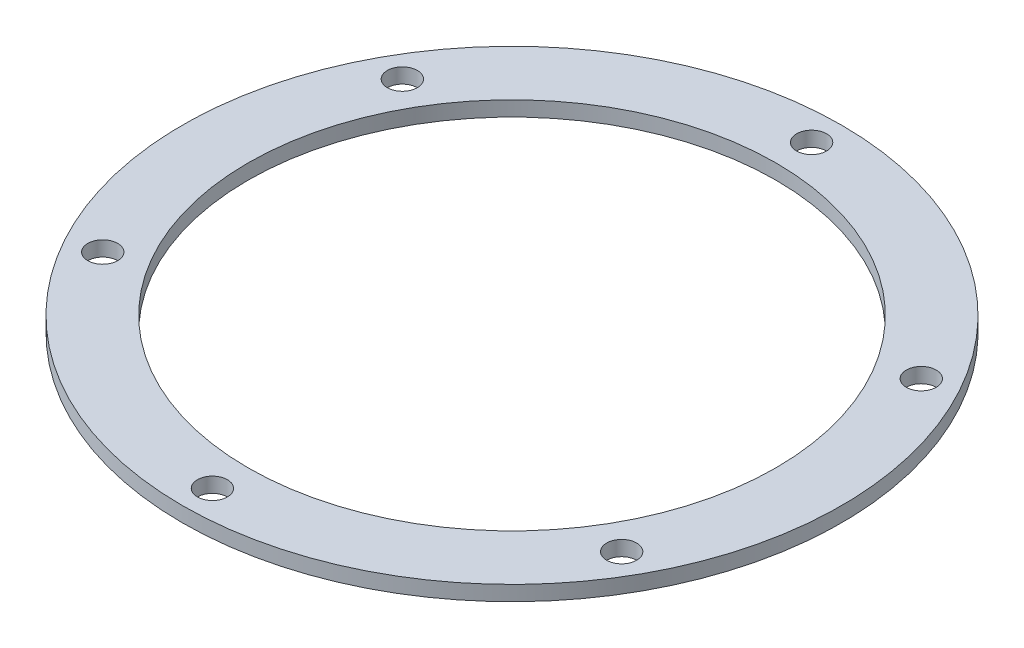
ISO-10303-21;
HEADER;
FILE_DESCRIPTION(('STEP AP214'),'2;1');
FILE_NAME('part.step','',(''),(''),'','','');
FILE_SCHEMA(('AUTOMOTIVE_DESIGN { 1 0 10303 214 1 1 1 1 }'));
ENDSEC;
DATA;
#1=APPLICATION_CONTEXT('core data for automotive mechanical design processes');
#2=APPLICATION_PROTOCOL_DEFINITION('international standard','automotive_design',2000,#1);
#3=PRODUCT_CONTEXT('',#1,'mechanical');
#4=PRODUCT('Part','Part','',(#3));
#5=PRODUCT_RELATED_PRODUCT_CATEGORY('part','',(#4));
#6=PRODUCT_DEFINITION_FORMATION('','',#4);
#7=PRODUCT_DEFINITION_CONTEXT('part definition',#1,'design');
#8=PRODUCT_DEFINITION('design','',#6,#7);
#9=PRODUCT_DEFINITION_SHAPE('','',#8);
#10=(LENGTH_UNIT() NAMED_UNIT(*) SI_UNIT(.MILLI.,.METRE.));
#11=(NAMED_UNIT(*) PLANE_ANGLE_UNIT() SI_UNIT($,.RADIAN.));
#12=(NAMED_UNIT(*) SI_UNIT($,.STERADIAN.) SOLID_ANGLE_UNIT());
#13=UNCERTAINTY_MEASURE_WITH_UNIT(LENGTH_MEASURE(1.E-05),#10,'distance_accuracy_value','');
#14=(GEOMETRIC_REPRESENTATION_CONTEXT(3) GLOBAL_UNCERTAINTY_ASSIGNED_CONTEXT((#13)) GLOBAL_UNIT_ASSIGNED_CONTEXT((#10,
#11,#12)) REPRESENTATION_CONTEXT('',''));
#15=CARTESIAN_POINT('',(0.,0.,0.));
#16=DIRECTION('',(0.,0.,1.));
#17=DIRECTION('',(1.,0.,0.));
#18=AXIS2_PLACEMENT_3D('',#15,#16,#17);
#19=CARTESIAN_POINT('',(0.,2.,0.));
#20=DIRECTION('',(0.,1.,0.));
#21=DIRECTION('',(0.,0.,1.));
#22=AXIS2_PLACEMENT_3D('',#19,#20,#21);
#23=PLANE('',#22);
#24=CARTESIAN_POINT('',(0.,2.,40.));
#25=DIRECTION('',(0.,1.,0.));
#26=DIRECTION('',(0.,0.,1.));
#27=AXIS2_PLACEMENT_3D('',#24,#25,#26);
#28=CIRCLE('',#27,2.00000000000001);
#29=CARTESIAN_POINT('',(0.,2.,42.));
#30=VERTEX_POINT('',#29);
#31=EDGE_CURVE('E77',#30,#30,#28,.T.);
#32=ORIENTED_EDGE('',*,*,#31,.F.);
#33=EDGE_LOOP('',(#32));
#34=FACE_BOUND('',#33,.T.);
#35=CARTESIAN_POINT('',(34.6410161513776,2.,-20.));
#36=DIRECTION('',(0.,1.,0.));
#37=DIRECTION('',(0.,0.,1.));
#38=AXIS2_PLACEMENT_3D('',#35,#36,#37);
#39=CIRCLE('',#38,2.00000000000002);
#40=CARTESIAN_POINT('',(34.6410161513776,2.,-18.));
#41=VERTEX_POINT('',#40);
#42=EDGE_CURVE('E65',#41,#41,#39,.T.);
#43=ORIENTED_EDGE('',*,*,#42,.F.);
#44=EDGE_LOOP('',(#43));
#45=FACE_BOUND('',#44,.T.);
#46=CARTESIAN_POINT('',(0.,2.,-40.));
#47=DIRECTION('',(0.,1.,0.));
#48=DIRECTION('',(0.,0.,1.));
#49=AXIS2_PLACEMENT_3D('',#46,#47,#48);
#50=CIRCLE('',#49,2.00000000000001);
#51=CARTESIAN_POINT('',(0.,2.,-38.));
#52=VERTEX_POINT('',#51);
#53=EDGE_CURVE('E53',#52,#52,#50,.T.);
#54=ORIENTED_EDGE('',*,*,#53,.F.);
#55=EDGE_LOOP('',(#54));
#56=FACE_BOUND('',#55,.T.);
#57=CARTESIAN_POINT('',(0.,2.,0.));
#58=DIRECTION('',(0.,1.,0.));
#59=DIRECTION('',(0.,0.,1.));
#60=AXIS2_PLACEMENT_3D('',#57,#58,#59);
#61=CIRCLE('',#60,44.);
#62=CARTESIAN_POINT('',(0.,2.,44.));
#63=VERTEX_POINT('',#62);
#64=EDGE_CURVE('E10',#63,#63,#61,.T.);
#65=ORIENTED_EDGE('',*,*,#64,.T.);
#66=EDGE_LOOP('',(#65));
#67=FACE_BOUND('',#66,.T.);
#68=CARTESIAN_POINT('',(0.,2.,0.));
#69=DIRECTION('',(0.,1.,0.));
#70=DIRECTION('',(0.,0.,1.));
#71=AXIS2_PLACEMENT_3D('',#68,#69,#70);
#72=CIRCLE('',#71,35.25);
#73=CARTESIAN_POINT('',(0.,2.,35.25));
#74=VERTEX_POINT('',#73);
#75=EDGE_CURVE('E48',#74,#74,#72,.T.);
#76=ORIENTED_EDGE('',*,*,#75,.F.);
#77=EDGE_LOOP('',(#76));
#78=FACE_BOUND('',#77,.T.);
#79=CARTESIAN_POINT('',(-34.6410161513775,2.,20.));
#80=DIRECTION('',(0.,1.,0.));
#81=DIRECTION('',(0.,0.,1.));
#82=AXIS2_PLACEMENT_3D('',#79,#80,#81);
#83=CIRCLE('',#82,2.00000000000001);
#84=CARTESIAN_POINT('',(-34.6410161513775,2.,22.));
#85=VERTEX_POINT('',#84);
#86=EDGE_CURVE('E59',#85,#85,#83,.T.);
#87=ORIENTED_EDGE('',*,*,#86,.F.);
#88=EDGE_LOOP('',(#87));
#89=FACE_BOUND('',#88,.T.);
#90=CARTESIAN_POINT('',(34.6410161513776,2.,20.));
#91=DIRECTION('',(0.,1.,0.));
#92=DIRECTION('',(0.,0.,1.));
#93=AXIS2_PLACEMENT_3D('',#90,#91,#92);
#94=CIRCLE('',#93,2.00000000000012);
#95=CARTESIAN_POINT('',(34.6410161513776,2.,22.0000000000001));
#96=VERTEX_POINT('',#95);
#97=EDGE_CURVE('E71',#96,#96,#94,.T.);
#98=ORIENTED_EDGE('',*,*,#97,.F.);
#99=EDGE_LOOP('',(#98));
#100=FACE_BOUND('',#99,.T.);
#101=CARTESIAN_POINT('',(-34.6410161513776,2.,-20.));
#102=DIRECTION('',(0.,1.,0.));
#103=DIRECTION('',(0.,0.,1.));
#104=AXIS2_PLACEMENT_3D('',#101,#102,#103);
#105=CIRCLE('',#104,2.00000000000001);
#106=CARTESIAN_POINT('',(-34.6410161513776,2.,-18.));
#107=VERTEX_POINT('',#106);
#108=EDGE_CURVE('E83',#107,#107,#105,.T.);
#109=ORIENTED_EDGE('',*,*,#108,.F.);
#110=EDGE_LOOP('',(#109));
#111=FACE_BOUND('',#110,.T.);
#112=ADVANCED_FACE('F37',(#34,#45,#56,#67,#78,#89,#100,#111),#23,.T.);
#113=CARTESIAN_POINT('',(0.,0.,0.));
#114=DIRECTION('',(0.,1.,0.));
#115=DIRECTION('',(0.,0.,1.));
#116=AXIS2_PLACEMENT_3D('',#113,#114,#115);
#117=PLANE('',#116);
#118=CARTESIAN_POINT('',(0.,0.,0.));
#119=DIRECTION('',(0.,1.,0.));
#120=DIRECTION('',(0.,0.,1.));
#121=AXIS2_PLACEMENT_3D('',#118,#119,#120);
#122=CIRCLE('',#121,44.);
#123=CARTESIAN_POINT('',(0.,0.,44.));
#124=VERTEX_POINT('',#123);
#125=EDGE_CURVE('E41',#124,#124,#122,.T.);
#126=ORIENTED_EDGE('',*,*,#125,.F.);
#127=EDGE_LOOP('',(#126));
#128=FACE_BOUND('',#127,.T.);
#129=CARTESIAN_POINT('',(0.,0.,0.));
#130=DIRECTION('',(0.,1.,0.));
#131=DIRECTION('',(0.,0.,1.));
#132=AXIS2_PLACEMENT_3D('',#129,#130,#131);
#133=CIRCLE('',#132,35.25);
#134=CARTESIAN_POINT('',(0.,0.,35.25));
#135=VERTEX_POINT('',#134);
#136=EDGE_CURVE('E50',#135,#135,#133,.T.);
#137=ORIENTED_EDGE('',*,*,#136,.T.);
#138=EDGE_LOOP('',(#137));
#139=FACE_BOUND('',#138,.T.);
#140=CARTESIAN_POINT('',(0.,0.,-40.));
#141=DIRECTION('',(0.,1.,0.));
#142=DIRECTION('',(0.,0.,1.));
#143=AXIS2_PLACEMENT_3D('',#140,#141,#142);
#144=CIRCLE('',#143,2.00000000000001);
#145=CARTESIAN_POINT('',(0.,0.,-38.));
#146=VERTEX_POINT('',#145);
#147=EDGE_CURVE('E56',#146,#146,#144,.T.);
#148=ORIENTED_EDGE('',*,*,#147,.T.);
#149=EDGE_LOOP('',(#148));
#150=FACE_BOUND('',#149,.T.);
#151=CARTESIAN_POINT('',(-34.6410161513775,0.,20.));
#152=DIRECTION('',(0.,1.,0.));
#153=DIRECTION('',(0.,0.,1.));
#154=AXIS2_PLACEMENT_3D('',#151,#152,#153);
#155=CIRCLE('',#154,2.00000000000001);
#156=CARTESIAN_POINT('',(-34.6410161513775,0.,22.));
#157=VERTEX_POINT('',#156);
#158=EDGE_CURVE('E62',#157,#157,#155,.T.);
#159=ORIENTED_EDGE('',*,*,#158,.T.);
#160=EDGE_LOOP('',(#159));
#161=FACE_BOUND('',#160,.T.);
#162=CARTESIAN_POINT('',(34.6410161513776,0.,-20.));
#163=DIRECTION('',(0.,1.,0.));
#164=DIRECTION('',(0.,0.,1.));
#165=AXIS2_PLACEMENT_3D('',#162,#163,#164);
#166=CIRCLE('',#165,2.00000000000002);
#167=CARTESIAN_POINT('',(34.6410161513776,0.,-18.));
#168=VERTEX_POINT('',#167);
#169=EDGE_CURVE('E68',#168,#168,#166,.T.);
#170=ORIENTED_EDGE('',*,*,#169,.T.);
#171=EDGE_LOOP('',(#170));
#172=FACE_BOUND('',#171,.T.);
#173=CARTESIAN_POINT('',(34.6410161513776,0.,20.));
#174=DIRECTION('',(0.,1.,0.));
#175=DIRECTION('',(0.,0.,1.));
#176=AXIS2_PLACEMENT_3D('',#173,#174,#175);
#177=CIRCLE('',#176,2.00000000000012);
#178=CARTESIAN_POINT('',(34.6410161513776,0.,22.0000000000001));
#179=VERTEX_POINT('',#178);
#180=EDGE_CURVE('E74',#179,#179,#177,.T.);
#181=ORIENTED_EDGE('',*,*,#180,.T.);
#182=EDGE_LOOP('',(#181));
#183=FACE_BOUND('',#182,.T.);
#184=CARTESIAN_POINT('',(0.,0.,40.));
#185=DIRECTION('',(0.,1.,0.));
#186=DIRECTION('',(0.,0.,1.));
#187=AXIS2_PLACEMENT_3D('',#184,#185,#186);
#188=CIRCLE('',#187,2.00000000000001);
#189=CARTESIAN_POINT('',(0.,0.,42.));
#190=VERTEX_POINT('',#189);
#191=EDGE_CURVE('E80',#190,#190,#188,.T.);
#192=ORIENTED_EDGE('',*,*,#191,.T.);
#193=EDGE_LOOP('',(#192));
#194=FACE_BOUND('',#193,.T.);
#195=CARTESIAN_POINT('',(-34.6410161513776,0.,-20.));
#196=DIRECTION('',(0.,1.,0.));
#197=DIRECTION('',(0.,0.,1.));
#198=AXIS2_PLACEMENT_3D('',#195,#196,#197);
#199=CIRCLE('',#198,2.00000000000001);
#200=CARTESIAN_POINT('',(-34.6410161513776,0.,-18.));
#201=VERTEX_POINT('',#200);
#202=EDGE_CURVE('E86',#201,#201,#199,.T.);
#203=ORIENTED_EDGE('',*,*,#202,.T.);
#204=EDGE_LOOP('',(#203));
#205=FACE_BOUND('',#204,.T.);
#206=ADVANCED_FACE('F96',(#128,#139,#150,#161,#172,#183,#194,#205),#117,.F.);
#207=CARTESIAN_POINT('',(0.,2.,0.));
#208=DIRECTION('',(0.,-1.,0.));
#209=DIRECTION('',(0.,0.,-1.));
#210=AXIS2_PLACEMENT_3D('',#207,#208,#209);
#211=CYLINDRICAL_SURFACE('',#210,44.);
#212=ORIENTED_EDGE('',*,*,#64,.F.);
#213=EDGE_LOOP('',(#212));
#214=FACE_BOUND('',#213,.T.);
#215=ORIENTED_EDGE('',*,*,#125,.T.);
#216=EDGE_LOOP('',(#215));
#217=FACE_BOUND('',#216,.T.);
#218=ADVANCED_FACE('F39',(#214,#217),#211,.T.);
#219=CARTESIAN_POINT('',(0.,2.,0.));
#220=DIRECTION('',(0.,-1.,0.));
#221=DIRECTION('',(0.,0.,-1.));
#222=AXIS2_PLACEMENT_3D('',#219,#220,#221);
#223=CYLINDRICAL_SURFACE('',#222,35.25);
#224=ORIENTED_EDGE('',*,*,#75,.T.);
#225=EDGE_LOOP('',(#224));
#226=FACE_BOUND('',#225,.T.);
#227=ORIENTED_EDGE('',*,*,#136,.F.);
#228=EDGE_LOOP('',(#227));
#229=FACE_BOUND('',#228,.T.);
#230=ADVANCED_FACE('F106',(#226,#229),#223,.F.);
#231=CARTESIAN_POINT('',(0.,2.,-40.));
#232=DIRECTION('',(0.,-1.,0.));
#233=DIRECTION('',(0.,0.,-1.));
#234=AXIS2_PLACEMENT_3D('',#231,#232,#233);
#235=CYLINDRICAL_SURFACE('',#234,2.00000000000001);
#236=ORIENTED_EDGE('',*,*,#53,.T.);
#237=EDGE_LOOP('',(#236));
#238=FACE_BOUND('',#237,.T.);
#239=ORIENTED_EDGE('',*,*,#147,.F.);
#240=EDGE_LOOP('',(#239));
#241=FACE_BOUND('',#240,.T.);
#242=ADVANCED_FACE('F109',(#238,#241),#235,.F.);
#243=CARTESIAN_POINT('',(-34.6410161513775,2.,20.));
#244=DIRECTION('',(0.,-1.,0.));
#245=DIRECTION('',(0.,0.,-1.));
#246=AXIS2_PLACEMENT_3D('',#243,#244,#245);
#247=CYLINDRICAL_SURFACE('',#246,2.00000000000001);
#248=ORIENTED_EDGE('',*,*,#86,.T.);
#249=EDGE_LOOP('',(#248));
#250=FACE_BOUND('',#249,.T.);
#251=ORIENTED_EDGE('',*,*,#158,.F.);
#252=EDGE_LOOP('',(#251));
#253=FACE_BOUND('',#252,.T.);
#254=ADVANCED_FACE('F113',(#250,#253),#247,.F.);
#255=CARTESIAN_POINT('',(34.6410161513776,2.,-20.));
#256=DIRECTION('',(0.,-1.,0.));
#257=DIRECTION('',(0.,0.,-1.));
#258=AXIS2_PLACEMENT_3D('',#255,#256,#257);
#259=CYLINDRICAL_SURFACE('',#258,2.00000000000002);
#260=ORIENTED_EDGE('',*,*,#42,.T.);
#261=EDGE_LOOP('',(#260));
#262=FACE_BOUND('',#261,.T.);
#263=ORIENTED_EDGE('',*,*,#169,.F.);
#264=EDGE_LOOP('',(#263));
#265=FACE_BOUND('',#264,.T.);
#266=ADVANCED_FACE('F117',(#262,#265),#259,.F.);
#267=CARTESIAN_POINT('',(34.6410161513776,2.,20.));
#268=DIRECTION('',(0.,-1.,0.));
#269=DIRECTION('',(0.,0.,-1.));
#270=AXIS2_PLACEMENT_3D('',#267,#268,#269);
#271=CYLINDRICAL_SURFACE('',#270,2.00000000000012);
#272=ORIENTED_EDGE('',*,*,#97,.T.);
#273=EDGE_LOOP('',(#272));
#274=FACE_BOUND('',#273,.T.);
#275=ORIENTED_EDGE('',*,*,#180,.F.);
#276=EDGE_LOOP('',(#275));
#277=FACE_BOUND('',#276,.T.);
#278=ADVANCED_FACE('F121',(#274,#277),#271,.F.);
#279=CARTESIAN_POINT('',(0.,2.,40.));
#280=DIRECTION('',(0.,-1.,0.));
#281=DIRECTION('',(0.,0.,-1.));
#282=AXIS2_PLACEMENT_3D('',#279,#280,#281);
#283=CYLINDRICAL_SURFACE('',#282,2.00000000000001);
#284=ORIENTED_EDGE('',*,*,#31,.T.);
#285=EDGE_LOOP('',(#284));
#286=FACE_BOUND('',#285,.T.);
#287=ORIENTED_EDGE('',*,*,#191,.F.);
#288=EDGE_LOOP('',(#287));
#289=FACE_BOUND('',#288,.T.);
#290=ADVANCED_FACE('F125',(#286,#289),#283,.F.);
#291=CARTESIAN_POINT('',(-34.6410161513776,2.,-20.));
#292=DIRECTION('',(0.,-1.,0.));
#293=DIRECTION('',(0.,0.,-1.));
#294=AXIS2_PLACEMENT_3D('',#291,#292,#293);
#295=CYLINDRICAL_SURFACE('',#294,2.00000000000001);
#296=ORIENTED_EDGE('',*,*,#108,.T.);
#297=EDGE_LOOP('',(#296));
#298=FACE_BOUND('',#297,.T.);
#299=ORIENTED_EDGE('',*,*,#202,.F.);
#300=EDGE_LOOP('',(#299));
#301=FACE_BOUND('',#300,.T.);
#302=ADVANCED_FACE('F92',(#298,#301),#295,.F.);
#303=CLOSED_SHELL('',(#112,#206,#218,#230,#242,#254,#266,#278,#290,#302));
#304=MANIFOLD_SOLID_BREP('B2',#303);
#305=ADVANCED_BREP_SHAPE_REPRESENTATION('',(#18,#304),#14);
#306=SHAPE_DEFINITION_REPRESENTATION(#9,#305);
ENDSEC;
END-ISO-10303-21;
